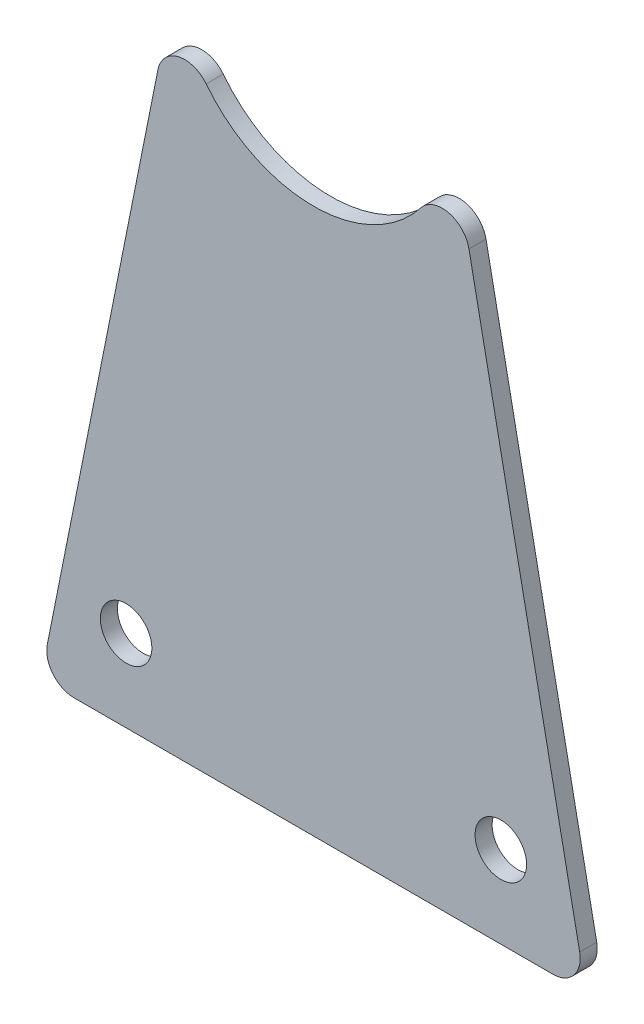
ISO-10303-21;
HEADER;
FILE_DESCRIPTION(('STEP AP214'),'2;1');
FILE_NAME('part.step','',(''),(''),'','','');
FILE_SCHEMA(('AUTOMOTIVE_DESIGN { 1 0 10303 214 1 1 1 1 }'));
ENDSEC;
DATA;
#1=APPLICATION_CONTEXT('core data for automotive mechanical design processes');
#2=APPLICATION_PROTOCOL_DEFINITION('international standard','automotive_design',2000,#1);
#3=PRODUCT_CONTEXT('',#1,'mechanical');
#4=PRODUCT('Part','Part','',(#3));
#5=PRODUCT_RELATED_PRODUCT_CATEGORY('part','',(#4));
#6=PRODUCT_DEFINITION_FORMATION('','',#4);
#7=PRODUCT_DEFINITION_CONTEXT('part definition',#1,'design');
#8=PRODUCT_DEFINITION('design','',#6,#7);
#9=PRODUCT_DEFINITION_SHAPE('','',#8);
#10=(LENGTH_UNIT() NAMED_UNIT(*) SI_UNIT(.MILLI.,.METRE.));
#11=(NAMED_UNIT(*) PLANE_ANGLE_UNIT() SI_UNIT($,.RADIAN.));
#12=(NAMED_UNIT(*) SI_UNIT($,.STERADIAN.) SOLID_ANGLE_UNIT());
#13=UNCERTAINTY_MEASURE_WITH_UNIT(LENGTH_MEASURE(1.E-05),#10,'distance_accuracy_value','');
#14=(GEOMETRIC_REPRESENTATION_CONTEXT(3) GLOBAL_UNCERTAINTY_ASSIGNED_CONTEXT((#13)) GLOBAL_UNIT_ASSIGNED_CONTEXT((#10,
#11,#12)) REPRESENTATION_CONTEXT('',''));
#15=CARTESIAN_POINT('',(0.,0.,0.));
#16=DIRECTION('',(0.,0.,1.));
#17=DIRECTION('',(1.,0.,0.));
#18=AXIS2_PLACEMENT_3D('',#15,#16,#17);
#19=CARTESIAN_POINT('',(0.,63.5,0.79375));
#20=DIRECTION('',(0.,0.,-1.));
#21=DIRECTION('',(-1.,0.,0.));
#22=AXIS2_PLACEMENT_3D('',#19,#20,#21);
#23=CYLINDRICAL_SURFACE('',#22,12.7);
#24=CARTESIAN_POINT('',(0.,63.5,0.79375));
#25=DIRECTION('',(0.,0.,-1.));
#26=DIRECTION('',(1.,0.,0.));
#27=AXIS2_PLACEMENT_3D('',#24,#25,#26);
#28=CIRCLE('',#27,12.7);
#29=CARTESIAN_POINT('',(9.99243714842253,55.6615562874493,0.79375));
#30=VERTEX_POINT('',#29);
#31=CARTESIAN_POINT('',(-9.99243714842253,55.6615562874493,0.79375));
#32=VERTEX_POINT('',#31);
#33=EDGE_CURVE('E138',#30,#32,#28,.T.);
#34=ORIENTED_EDGE('',*,*,#33,.F.);
#35=DIRECTION('',(0.,0.,-1.));
#36=VECTOR('',#35,1.);
#37=CARTESIAN_POINT('',(9.99243714842253,55.6615562874493,0.79375));
#38=LINE('',#37,#36);
#39=CARTESIAN_POINT('',(9.99243714842253,55.6615562874493,-0.79375));
#40=VERTEX_POINT('',#39);
#41=EDGE_CURVE('E11',#30,#40,#38,.T.);
#42=ORIENTED_EDGE('',*,*,#41,.T.);
#43=CARTESIAN_POINT('',(0.,63.5,-0.79375));
#44=DIRECTION('',(0.,0.,-1.));
#45=DIRECTION('',(1.,0.,0.));
#46=AXIS2_PLACEMENT_3D('',#43,#44,#45);
#47=CIRCLE('',#46,12.7);
#48=CARTESIAN_POINT('',(-9.99243714842253,55.6615562874493,-0.79375));
#49=VERTEX_POINT('',#48);
#50=EDGE_CURVE('E186',#40,#49,#47,.T.);
#51=ORIENTED_EDGE('',*,*,#50,.T.);
#52=DIRECTION('',(0.,0.,-1.));
#53=VECTOR('',#52,1.);
#54=CARTESIAN_POINT('',(-9.99243714842253,55.6615562874493,0.79375));
#55=LINE('',#54,#53);
#56=EDGE_CURVE('E49',#49,#32,#55,.F.);
#57=ORIENTED_EDGE('',*,*,#56,.T.);
#58=EDGE_LOOP('',(#34,#42,#51,#57));
#59=FACE_BOUND('',#58,.T.);
#60=ADVANCED_FACE('F40',(#59),#23,.F.);
#61=CARTESIAN_POINT('',(-12.7,63.5,0.79375));
#62=DIRECTION('',(0.98058067569092,-0.196116135138184,0.));
#63=DIRECTION('',(0.196116135138184,0.98058067569092,0.));
#64=AXIS2_PLACEMENT_3D('',#61,#62,#63);
#65=PLANE('',#64);
#66=DIRECTION('',(-0.196116135138184,-0.98058067569092,0.));
#67=VECTOR('',#66,1.);
#68=CARTESIAN_POINT('',(-12.7,63.5,-0.79375));
#69=LINE('',#68,#67);
#70=CARTESIAN_POINT('',(-14.481599494362,54.5920025281902,-0.79375));
#71=VERTEX_POINT('',#70);
#72=CARTESIAN_POINT('',(-24.7923730033498,3.03813498325097,-0.79375));
#73=VERTEX_POINT('',#72);
#74=EDGE_CURVE('E146',#71,#73,#69,.T.);
#75=ORIENTED_EDGE('',*,*,#74,.T.);
#76=DIRECTION('',(0.,0.,-1.));
#77=VECTOR('',#76,1.);
#78=CARTESIAN_POINT('',(-24.7923730033498,3.03813498325098,0.79375));
#79=LINE('',#78,#77);
#80=CARTESIAN_POINT('',(-24.7923730033498,3.03813498325097,0.79375));
#81=VERTEX_POINT('',#80);
#82=EDGE_CURVE('E56',#73,#81,#79,.F.);
#83=ORIENTED_EDGE('',*,*,#82,.T.);
#84=DIRECTION('',(-0.196116135138184,-0.98058067569092,0.));
#85=VECTOR('',#84,1.);
#86=CARTESIAN_POINT('',(-12.7,63.5,0.79375));
#87=LINE('',#86,#85);
#88=CARTESIAN_POINT('',(-14.481599494362,54.5920025281902,0.79375));
#89=VERTEX_POINT('',#88);
#90=EDGE_CURVE('E144',#89,#81,#87,.T.);
#91=ORIENTED_EDGE('',*,*,#90,.F.);
#92=DIRECTION('',(0.,0.,-1.));
#93=VECTOR('',#92,1.);
#94=CARTESIAN_POINT('',(-14.481599494362,54.5920025281902,0.79375));
#95=LINE('',#94,#93);
#96=EDGE_CURVE('E174',#89,#71,#95,.T.);
#97=ORIENTED_EDGE('',*,*,#96,.T.);
#98=EDGE_LOOP('',(#75,#83,#91,#97));
#99=FACE_BOUND('',#98,.T.);
#100=ADVANCED_FACE('F193',(#99),#65,.F.);
#101=CARTESIAN_POINT('',(-25.4,0.,0.79375));
#102=DIRECTION('',(0.,1.,0.));
#103=DIRECTION('',(0.,0.,1.));
#104=AXIS2_PLACEMENT_3D('',#101,#102,#103);
#105=PLANE('',#104);
#106=DIRECTION('',(1.,0.,0.));
#107=VECTOR('',#106,1.);
#108=CARTESIAN_POINT('',(-25.4,0.,-0.79375));
#109=LINE('',#108,#107);
#110=CARTESIAN_POINT('',(-22.3016980870949,0.,-0.79375));
#111=VERTEX_POINT('',#110);
#112=CARTESIAN_POINT('',(22.3016980870949,0.,-0.79375));
#113=VERTEX_POINT('',#112);
#114=EDGE_CURVE('E139',#111,#113,#109,.T.);
#115=ORIENTED_EDGE('',*,*,#114,.T.);
#116=DIRECTION('',(0.,0.,-1.));
#117=VECTOR('',#116,1.);
#118=CARTESIAN_POINT('',(22.3016980870949,0.,0.79375));
#119=LINE('',#118,#117);
#120=CARTESIAN_POINT('',(22.3016980870949,0.,0.79375));
#121=VERTEX_POINT('',#120);
#122=EDGE_CURVE('E113',#113,#121,#119,.F.);
#123=ORIENTED_EDGE('',*,*,#122,.T.);
#124=DIRECTION('',(1.,0.,0.));
#125=VECTOR('',#124,1.);
#126=CARTESIAN_POINT('',(-25.4,0.,0.79375));
#127=LINE('',#126,#125);
#128=CARTESIAN_POINT('',(-22.3016980870949,0.,0.79375));
#129=VERTEX_POINT('',#128);
#130=EDGE_CURVE('E202',#129,#121,#127,.T.);
#131=ORIENTED_EDGE('',*,*,#130,.F.);
#132=DIRECTION('',(0.,0.,-1.));
#133=VECTOR('',#132,1.);
#134=CARTESIAN_POINT('',(-22.3016980870949,0.,0.79375));
#135=LINE('',#134,#133);
#136=EDGE_CURVE('E119',#129,#111,#135,.T.);
#137=ORIENTED_EDGE('',*,*,#136,.T.);
#138=EDGE_LOOP('',(#115,#123,#131,#137));
#139=FACE_BOUND('',#138,.T.);
#140=ADVANCED_FACE('F249',(#139),#105,.F.);
#141=CARTESIAN_POINT('',(12.7,63.5,0.79375));
#142=DIRECTION('',(-0.98058067569092,-0.196116135138184,0.));
#143=DIRECTION('',(0.196116135138184,-0.98058067569092,0.));
#144=AXIS2_PLACEMENT_3D('',#141,#142,#143);
#145=PLANE('',#144);
#146=DIRECTION('',(-0.196116135138184,0.98058067569092,0.));
#147=VECTOR('',#146,1.);
#148=CARTESIAN_POINT('',(12.7,63.5,0.79375));
#149=LINE('',#148,#147);
#150=CARTESIAN_POINT('',(24.7923730033498,3.03813498325098,0.79375));
#151=VERTEX_POINT('',#150);
#152=CARTESIAN_POINT('',(14.481599494362,54.5920025281902,0.79375));
#153=VERTEX_POINT('',#152);
#154=EDGE_CURVE('E129',#151,#153,#149,.T.);
#155=ORIENTED_EDGE('',*,*,#154,.F.);
#156=DIRECTION('',(0.,0.,-1.));
#157=VECTOR('',#156,1.);
#158=CARTESIAN_POINT('',(24.7923730033498,3.03813498325098,0.79375));
#159=LINE('',#158,#157);
#160=CARTESIAN_POINT('',(24.7923730033498,3.03813498325098,-0.79375));
#161=VERTEX_POINT('',#160);
#162=EDGE_CURVE('E112',#151,#161,#159,.T.);
#163=ORIENTED_EDGE('',*,*,#162,.T.);
#164=DIRECTION('',(-0.196116135138184,0.98058067569092,0.));
#165=VECTOR('',#164,1.);
#166=CARTESIAN_POINT('',(12.7,63.5,-0.79375));
#167=LINE('',#166,#165);
#168=CARTESIAN_POINT('',(14.481599494362,54.5920025281902,-0.79375));
#169=VERTEX_POINT('',#168);
#170=EDGE_CURVE('E126',#161,#169,#167,.T.);
#171=ORIENTED_EDGE('',*,*,#170,.T.);
#172=DIRECTION('',(0.,0.,-1.));
#173=VECTOR('',#172,1.);
#174=CARTESIAN_POINT('',(14.481599494362,54.5920025281902,0.79375));
#175=LINE('',#174,#173);
#176=EDGE_CURVE('E132',#169,#153,#175,.F.);
#177=ORIENTED_EDGE('',*,*,#176,.T.);
#178=EDGE_LOOP('',(#155,#163,#171,#177));
#179=FACE_BOUND('',#178,.T.);
#180=ADVANCED_FACE('F125',(#179),#145,.F.);
#181=CARTESIAN_POINT('',(0.,63.5,0.79375));
#182=DIRECTION('',(0.,0.,1.));
#183=DIRECTION('',(1.,0.,0.));
#184=AXIS2_PLACEMENT_3D('',#181,#182,#183);
#185=PLANE('',#184);
#186=CARTESIAN_POINT('',(-17.45,7.62,0.793750000000001));
#187=DIRECTION('',(0.,0.,1.));
#188=DIRECTION('',(1.,0.,0.));
#189=AXIS2_PLACEMENT_3D('',#186,#187,#188);
#190=CIRCLE('',#189,2.39999999999999);
#191=CARTESIAN_POINT('',(-15.05,7.62,0.793750000000001));
#192=VERTEX_POINT('',#191);
#193=EDGE_CURVE('E218',#192,#192,#190,.T.);
#194=ORIENTED_EDGE('',*,*,#193,.F.);
#195=EDGE_LOOP('',(#194));
#196=FACE_BOUND('',#195,.T.);
#197=CARTESIAN_POINT('',(17.45,7.62,0.793750000000001));
#198=DIRECTION('',(0.,0.,1.));
#199=DIRECTION('',(1.,0.,0.));
#200=AXIS2_PLACEMENT_3D('',#197,#198,#199);
#201=CIRCLE('',#200,2.39999999999999);
#202=CARTESIAN_POINT('',(19.85,7.62,0.793750000000001));
#203=VERTEX_POINT('',#202);
#204=EDGE_CURVE('E210',#203,#203,#201,.T.);
#205=ORIENTED_EDGE('',*,*,#204,.F.);
#206=EDGE_LOOP('',(#205));
#207=FACE_BOUND('',#206,.T.);
#208=ORIENTED_EDGE('',*,*,#130,.T.);
#209=CARTESIAN_POINT('',(22.3016980870949,2.54,0.79375));
#210=DIRECTION('',(0.,0.,1.));
#211=DIRECTION('',(1.,0.,0.));
#212=AXIS2_PLACEMENT_3D('',#209,#210,#211);
#213=CIRCLE('',#212,2.54);
#214=EDGE_CURVE('E171',#121,#151,#213,.T.);
#215=ORIENTED_EDGE('',*,*,#214,.T.);
#216=ORIENTED_EDGE('',*,*,#154,.T.);
#217=CARTESIAN_POINT('',(11.990924578107,54.0938675449392,0.79375));
#218=DIRECTION('',(0.,0.,1.));
#219=DIRECTION('',(1.,0.,0.));
#220=AXIS2_PLACEMENT_3D('',#217,#218,#219);
#221=CIRCLE('',#220,2.54);
#222=EDGE_CURVE('E165',#153,#30,#221,.T.);
#223=ORIENTED_EDGE('',*,*,#222,.T.);
#224=ORIENTED_EDGE('',*,*,#33,.T.);
#225=CARTESIAN_POINT('',(-11.990924578107,54.0938675449392,0.79375));
#226=DIRECTION('',(0.,0.,1.));
#227=DIRECTION('',(1.,0.,0.));
#228=AXIS2_PLACEMENT_3D('',#225,#226,#227);
#229=CIRCLE('',#228,2.54);
#230=EDGE_CURVE('E63',#32,#89,#229,.T.);
#231=ORIENTED_EDGE('',*,*,#230,.T.);
#232=ORIENTED_EDGE('',*,*,#90,.T.);
#233=CARTESIAN_POINT('',(-22.3016980870949,2.54,0.79375));
#234=DIRECTION('',(0.,0.,1.));
#235=DIRECTION('',(1.,0.,0.));
#236=AXIS2_PLACEMENT_3D('',#233,#234,#235);
#237=CIRCLE('',#236,2.54);
#238=EDGE_CURVE('E168',#81,#129,#237,.T.);
#239=ORIENTED_EDGE('',*,*,#238,.T.);
#240=EDGE_LOOP('',(#208,#215,#216,#223,#224,#231,#232,#239));
#241=FACE_BOUND('',#240,.T.);
#242=ADVANCED_FACE('F189',(#196,#207,#241),#185,.T.);
#243=CARTESIAN_POINT('',(0.,63.5,-0.79375));
#244=DIRECTION('',(0.,0.,1.));
#245=DIRECTION('',(1.,0.,0.));
#246=AXIS2_PLACEMENT_3D('',#243,#244,#245);
#247=PLANE('',#246);
#248=CARTESIAN_POINT('',(-17.45,7.62,-0.79375));
#249=DIRECTION('',(0.,0.,1.));
#250=DIRECTION('',(1.,0.,0.));
#251=AXIS2_PLACEMENT_3D('',#248,#249,#250);
#252=CIRCLE('',#251,2.39999999999999);
#253=CARTESIAN_POINT('',(-15.05,7.62,-0.79375));
#254=VERTEX_POINT('',#253);
#255=EDGE_CURVE('E214',#254,#254,#252,.T.);
#256=ORIENTED_EDGE('',*,*,#255,.T.);
#257=EDGE_LOOP('',(#256));
#258=FACE_BOUND('',#257,.T.);
#259=CARTESIAN_POINT('',(17.45,7.62,-0.79375));
#260=DIRECTION('',(0.,0.,1.));
#261=DIRECTION('',(1.,0.,0.));
#262=AXIS2_PLACEMENT_3D('',#259,#260,#261);
#263=CIRCLE('',#262,2.39999999999999);
#264=CARTESIAN_POINT('',(19.85,7.62,-0.79375));
#265=VERTEX_POINT('',#264);
#266=EDGE_CURVE('E197',#265,#265,#263,.T.);
#267=ORIENTED_EDGE('',*,*,#266,.T.);
#268=EDGE_LOOP('',(#267));
#269=FACE_BOUND('',#268,.T.);
#270=ORIENTED_EDGE('',*,*,#170,.F.);
#271=CARTESIAN_POINT('',(22.3016980870949,2.54,-0.79375));
#272=DIRECTION('',(0.,0.,1.));
#273=DIRECTION('',(1.,0.,0.));
#274=AXIS2_PLACEMENT_3D('',#271,#272,#273);
#275=CIRCLE('',#274,2.54);
#276=EDGE_CURVE('E108',#161,#113,#275,.F.);
#277=ORIENTED_EDGE('',*,*,#276,.T.);
#278=ORIENTED_EDGE('',*,*,#114,.F.);
#279=CARTESIAN_POINT('',(-22.3016980870949,2.54,-0.79375));
#280=DIRECTION('',(0.,0.,1.));
#281=DIRECTION('',(1.,0.,0.));
#282=AXIS2_PLACEMENT_3D('',#279,#280,#281);
#283=CIRCLE('',#282,2.54);
#284=EDGE_CURVE('E120',#111,#73,#283,.F.);
#285=ORIENTED_EDGE('',*,*,#284,.T.);
#286=ORIENTED_EDGE('',*,*,#74,.F.);
#287=CARTESIAN_POINT('',(-11.990924578107,54.0938675449392,-0.79375));
#288=DIRECTION('',(0.,0.,1.));
#289=DIRECTION('',(1.,0.,0.));
#290=AXIS2_PLACEMENT_3D('',#287,#288,#289);
#291=CIRCLE('',#290,2.54);
#292=EDGE_CURVE('E131',#71,#49,#291,.F.);
#293=ORIENTED_EDGE('',*,*,#292,.T.);
#294=ORIENTED_EDGE('',*,*,#50,.F.);
#295=CARTESIAN_POINT('',(11.990924578107,54.0938675449392,-0.79375));
#296=DIRECTION('',(0.,0.,1.));
#297=DIRECTION('',(1.,0.,0.));
#298=AXIS2_PLACEMENT_3D('',#295,#296,#297);
#299=CIRCLE('',#298,2.54);
#300=EDGE_CURVE('E136',#40,#169,#299,.F.);
#301=ORIENTED_EDGE('',*,*,#300,.T.);
#302=EDGE_LOOP('',(#270,#277,#278,#285,#286,#293,#294,#301));
#303=FACE_BOUND('',#302,.T.);
#304=ADVANCED_FACE('F134',(#258,#269,#303),#247,.F.);
#305=CARTESIAN_POINT('',(17.45,7.62,0.79375));
#306=DIRECTION('',(0.,0.,1.));
#307=DIRECTION('',(1.,0.,0.));
#308=AXIS2_PLACEMENT_3D('',#305,#306,#307);
#309=CYLINDRICAL_SURFACE('',#308,2.39999999999999);
#310=ORIENTED_EDGE('',*,*,#266,.F.);
#311=EDGE_LOOP('',(#310));
#312=FACE_BOUND('',#311,.T.);
#313=ORIENTED_EDGE('',*,*,#204,.T.);
#314=EDGE_LOOP('',(#313));
#315=FACE_BOUND('',#314,.T.);
#316=ADVANCED_FACE('F231',(#312,#315),#309,.F.);
#317=CARTESIAN_POINT('',(-17.45,7.62,0.79375));
#318=DIRECTION('',(0.,0.,1.));
#319=DIRECTION('',(1.,0.,0.));
#320=AXIS2_PLACEMENT_3D('',#317,#318,#319);
#321=CYLINDRICAL_SURFACE('',#320,2.39999999999999);
#322=ORIENTED_EDGE('',*,*,#255,.F.);
#323=EDGE_LOOP('',(#322));
#324=FACE_BOUND('',#323,.T.);
#325=ORIENTED_EDGE('',*,*,#193,.T.);
#326=EDGE_LOOP('',(#325));
#327=FACE_BOUND('',#326,.T.);
#328=ADVANCED_FACE('F224',(#324,#327),#321,.F.);
#329=CARTESIAN_POINT('',(22.3016980870949,2.54,0.79375));
#330=DIRECTION('',(0.,0.,-1.));
#331=DIRECTION('',(-1.,0.,0.));
#332=AXIS2_PLACEMENT_3D('',#329,#330,#331);
#333=CYLINDRICAL_SURFACE('',#332,2.54);
#334=ORIENTED_EDGE('',*,*,#214,.F.);
#335=ORIENTED_EDGE('',*,*,#122,.F.);
#336=ORIENTED_EDGE('',*,*,#276,.F.);
#337=ORIENTED_EDGE('',*,*,#162,.F.);
#338=EDGE_LOOP('',(#334,#335,#336,#337));
#339=FACE_BOUND('',#338,.T.);
#340=ADVANCED_FACE('F111',(#339),#333,.T.);
#341=CARTESIAN_POINT('',(-22.3016980870949,2.54,0.79375));
#342=DIRECTION('',(0.,0.,-1.));
#343=DIRECTION('',(-1.,0.,0.));
#344=AXIS2_PLACEMENT_3D('',#341,#342,#343);
#345=CYLINDRICAL_SURFACE('',#344,2.54);
#346=ORIENTED_EDGE('',*,*,#238,.F.);
#347=ORIENTED_EDGE('',*,*,#82,.F.);
#348=ORIENTED_EDGE('',*,*,#284,.F.);
#349=ORIENTED_EDGE('',*,*,#136,.F.);
#350=EDGE_LOOP('',(#346,#347,#348,#349));
#351=FACE_BOUND('',#350,.T.);
#352=ADVANCED_FACE('F255',(#351),#345,.T.);
#353=CARTESIAN_POINT('',(11.990924578107,54.0938675449392,0.79375));
#354=DIRECTION('',(0.,0.,-1.));
#355=DIRECTION('',(-1.,0.,0.));
#356=AXIS2_PLACEMENT_3D('',#353,#354,#355);
#357=CYLINDRICAL_SURFACE('',#356,2.54);
#358=ORIENTED_EDGE('',*,*,#222,.F.);
#359=ORIENTED_EDGE('',*,*,#176,.F.);
#360=ORIENTED_EDGE('',*,*,#300,.F.);
#361=ORIENTED_EDGE('',*,*,#41,.F.);
#362=EDGE_LOOP('',(#358,#359,#360,#361));
#363=FACE_BOUND('',#362,.T.);
#364=ADVANCED_FACE('F257',(#363),#357,.T.);
#365=CARTESIAN_POINT('',(-11.990924578107,54.0938675449392,0.79375));
#366=DIRECTION('',(0.,0.,-1.));
#367=DIRECTION('',(-1.,0.,0.));
#368=AXIS2_PLACEMENT_3D('',#365,#366,#367);
#369=CYLINDRICAL_SURFACE('',#368,2.54);
#370=ORIENTED_EDGE('',*,*,#230,.F.);
#371=ORIENTED_EDGE('',*,*,#56,.F.);
#372=ORIENTED_EDGE('',*,*,#292,.F.);
#373=ORIENTED_EDGE('',*,*,#96,.F.);
#374=EDGE_LOOP('',(#370,#371,#372,#373));
#375=FACE_BOUND('',#374,.T.);
#376=ADVANCED_FACE('F42',(#375),#369,.T.);
#377=CLOSED_SHELL('',(#60,#100,#140,#180,#242,#304,#316,#328,#340,#352,#364,#376));
#378=MANIFOLD_SOLID_BREP('B2',#377);
#379=ADVANCED_BREP_SHAPE_REPRESENTATION('',(#18,#378),#14);
#380=SHAPE_DEFINITION_REPRESENTATION(#9,#379);
ENDSEC;
END-ISO-10303-21;
